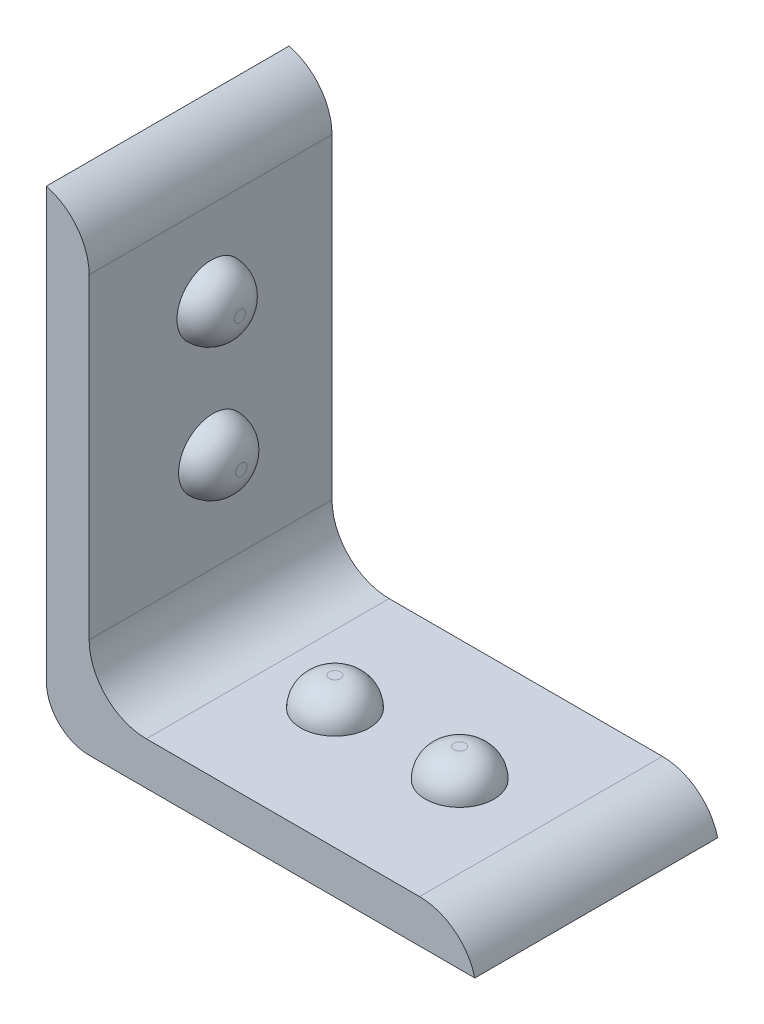
ISO-10303-21;
HEADER;
FILE_DESCRIPTION(('STEP AP214'),'2;1');
FILE_NAME('part.step','',(''),(''),'','','');
FILE_SCHEMA(('AUTOMOTIVE_DESIGN { 1 0 10303 214 1 1 1 1 }'));
ENDSEC;
DATA;
#1=APPLICATION_CONTEXT('core data for automotive mechanical design processes');
#2=APPLICATION_PROTOCOL_DEFINITION('international standard','automotive_design',2000,#1);
#3=PRODUCT_CONTEXT('',#1,'mechanical');
#4=PRODUCT('Part','Part','',(#3));
#5=PRODUCT_RELATED_PRODUCT_CATEGORY('part','',(#4));
#6=PRODUCT_DEFINITION_FORMATION('','',#4);
#7=PRODUCT_DEFINITION_CONTEXT('part definition',#1,'design');
#8=PRODUCT_DEFINITION('design','',#6,#7);
#9=PRODUCT_DEFINITION_SHAPE('','',#8);
#10=(LENGTH_UNIT() NAMED_UNIT(*) SI_UNIT(.MILLI.,.METRE.));
#11=(NAMED_UNIT(*) PLANE_ANGLE_UNIT() SI_UNIT($,.RADIAN.));
#12=(NAMED_UNIT(*) SI_UNIT($,.STERADIAN.) SOLID_ANGLE_UNIT());
#13=UNCERTAINTY_MEASURE_WITH_UNIT(LENGTH_MEASURE(1.E-05),#10,'distance_accuracy_value','');
#14=(GEOMETRIC_REPRESENTATION_CONTEXT(3) GLOBAL_UNCERTAINTY_ASSIGNED_CONTEXT((#13)) GLOBAL_UNIT_ASSIGNED_CONTEXT((#10,
#11,#12)) REPRESENTATION_CONTEXT('',''));
#15=CARTESIAN_POINT('',(0.,0.,0.));
#16=DIRECTION('',(0.,0.,1.));
#17=DIRECTION('',(1.,0.,0.));
#18=AXIS2_PLACEMENT_3D('',#15,#16,#17);
#19=CARTESIAN_POINT('',(0.,3.81,0.));
#20=DIRECTION('',(0.,-1.,0.));
#21=DIRECTION('',(0.,0.,-1.));
#22=AXIS2_PLACEMENT_3D('',#19,#20,#21);
#23=PLANE('',#22);
#24=CARTESIAN_POINT('',(-21.629116904149,3.81,11.4432822151741));
#25=DIRECTION('',(0.,-1.,0.));
#26=DIRECTION('',(0.,0.,-1.));
#27=AXIS2_PLACEMENT_3D('',#24,#25,#26);
#28=CIRCLE('',#27,3.048);
#29=CARTESIAN_POINT('',(-21.629116904149,3.81,8.3952822151741));
#30=VERTEX_POINT('',#29);
#31=EDGE_CURVE('E211',#30,#30,#28,.F.);
#32=ORIENTED_EDGE('',*,*,#31,.F.);
#33=EDGE_LOOP('',(#32));
#34=FACE_BOUND('',#33,.T.);
#35=CARTESIAN_POINT('',(-32.655326175498,3.81,11.503425174836));
#36=DIRECTION('',(0.,-1.,0.));
#37=DIRECTION('',(0.,0.,-1.));
#38=AXIS2_PLACEMENT_3D('',#35,#36,#37);
#39=CIRCLE('',#38,3.048);
#40=CARTESIAN_POINT('',(-32.655326175498,3.81,8.455425174836));
#41=VERTEX_POINT('',#40);
#42=EDGE_CURVE('E207',#41,#41,#39,.F.);
#43=ORIENTED_EDGE('',*,*,#42,.F.);
#44=EDGE_LOOP('',(#43));
#45=FACE_BOUND('',#44,.T.);
#46=DIRECTION('',(1.,0.,0.));
#47=VECTOR('',#46,1.);
#48=CARTESIAN_POINT('',(-47.5755096120473,3.81,22.2483060417843));
#49=LINE('',#48,#47);
#50=CARTESIAN_POINT('',(-38.6855096120473,3.81,22.2483060417843));
#51=VERTEX_POINT('',#50);
#52=CARTESIAN_POINT('',(-14.3941984617307,3.81,22.2483060417843));
#53=VERTEX_POINT('',#52);
#54=EDGE_CURVE('E145',#51,#53,#49,.T.);
#55=ORIENTED_EDGE('',*,*,#54,.T.);
#56=DIRECTION('',(0.,0.,-1.));
#57=VECTOR('',#56,1.);
#58=CARTESIAN_POINT('',(-14.3941984617307,3.81,0.));
#59=LINE('',#58,#57);
#60=CARTESIAN_POINT('',(-14.3941984617307,3.81,0.658306041784296));
#61=VERTEX_POINT('',#60);
#62=EDGE_CURVE('E168',#53,#61,#59,.T.);
#63=ORIENTED_EDGE('',*,*,#62,.T.);
#64=DIRECTION('',(1.,0.,0.));
#65=VECTOR('',#64,1.);
#66=CARTESIAN_POINT('',(-47.5755096120473,3.81,0.658306041784296));
#67=LINE('',#66,#65);
#68=CARTESIAN_POINT('',(-38.6855096120473,3.81,0.658306041784296));
#69=VERTEX_POINT('',#68);
#70=EDGE_CURVE('E130',#69,#61,#67,.T.);
#71=ORIENTED_EDGE('',*,*,#70,.F.);
#72=DIRECTION('',(0.,0.,-1.));
#73=VECTOR('',#72,1.);
#74=CARTESIAN_POINT('',(-38.6855096120473,3.81,22.2483060417843));
#75=LINE('',#74,#73);
#76=EDGE_CURVE('E165',#69,#51,#75,.F.);
#77=ORIENTED_EDGE('',*,*,#76,.T.);
#78=EDGE_LOOP('',(#55,#63,#71,#77));
#79=FACE_BOUND('',#78,.T.);
#80=ADVANCED_FACE('F43',(#34,#45,#79),#23,.F.);
#81=CARTESIAN_POINT('',(-47.5755096120473,3.81,22.2483060417843));
#82=DIRECTION('',(0.,0.,-1.));
#83=DIRECTION('',(-1.,0.,0.));
#84=AXIS2_PLACEMENT_3D('',#81,#82,#83);
#85=PLANE('',#84);
#86=DIRECTION('',(0.,-1.,0.));
#87=VECTOR('',#86,1.);
#88=CARTESIAN_POINT('',(-47.5755096120473,3.81,22.2483060417843));
#89=LINE('',#88,#87);
#90=CARTESIAN_POINT('',(-47.5755096120473,41.91,22.2483060417843));
#91=VERTEX_POINT('',#90);
#92=CARTESIAN_POINT('',(-47.5755096120473,3.81,22.2483060417843));
#93=VERTEX_POINT('',#92);
#94=EDGE_CURVE('E111',#91,#93,#89,.T.);
#95=ORIENTED_EDGE('',*,*,#94,.T.);
#96=CARTESIAN_POINT('',(-43.7655096120473,3.81,22.2483060417843));
#97=DIRECTION('',(0.,0.,-1.));
#98=DIRECTION('',(-1.,0.,0.));
#99=AXIS2_PLACEMENT_3D('',#96,#97,#98);
#100=CIRCLE('',#99,3.81);
#101=CARTESIAN_POINT('',(-43.7655096120473,0.,22.2483060417843));
#102=VERTEX_POINT('',#101);
#103=EDGE_CURVE('E67',#93,#102,#100,.F.);
#104=ORIENTED_EDGE('',*,*,#103,.T.);
#105=DIRECTION('',(1.,0.,0.));
#106=VECTOR('',#105,1.);
#107=CARTESIAN_POINT('',(-47.5755096120473,0.,22.2483060417843));
#108=LINE('',#107,#106);
#109=CARTESIAN_POINT('',(-9.47550961204729,0.,22.2483060417843));
#110=VERTEX_POINT('',#109);
#111=EDGE_CURVE('E144',#102,#110,#108,.T.);
#112=ORIENTED_EDGE('',*,*,#111,.T.);
#113=CARTESIAN_POINT('',(-14.3941984617307,-1.27,22.2483060417843));
#114=DIRECTION('',(0.,0.,-1.));
#115=DIRECTION('',(-1.,0.,0.));
#116=AXIS2_PLACEMENT_3D('',#113,#114,#115);
#117=CIRCLE('',#116,5.08);
#118=EDGE_CURVE('E118',#110,#53,#117,.F.);
#119=ORIENTED_EDGE('',*,*,#118,.T.);
#120=ORIENTED_EDGE('',*,*,#54,.F.);
#121=CARTESIAN_POINT('',(-38.6855096120473,8.89,22.2483060417843));
#122=DIRECTION('',(0.,0.,-1.));
#123=DIRECTION('',(-1.,0.,0.));
#124=AXIS2_PLACEMENT_3D('',#121,#122,#123);
#125=CIRCLE('',#124,5.08);
#126=CARTESIAN_POINT('',(-43.7655096120473,8.89000000000002,22.2483060417843));
#127=VERTEX_POINT('',#126);
#128=EDGE_CURVE('E187',#51,#127,#125,.T.);
#129=ORIENTED_EDGE('',*,*,#128,.T.);
#130=DIRECTION('',(0.,-1.,0.));
#131=VECTOR('',#130,1.);
#132=CARTESIAN_POINT('',(-43.7655096120473,41.91,22.2483060417843));
#133=LINE('',#132,#131);
#134=CARTESIAN_POINT('',(-43.7655096120473,36.9913111503166,22.2483060417843));
#135=VERTEX_POINT('',#134);
#136=EDGE_CURVE('E113',#135,#127,#133,.T.);
#137=ORIENTED_EDGE('',*,*,#136,.F.);
#138=CARTESIAN_POINT('',(-48.8455096120473,36.9913111503166,22.2483060417843));
#139=DIRECTION('',(0.,0.,-1.));
#140=DIRECTION('',(-1.,0.,0.));
#141=AXIS2_PLACEMENT_3D('',#138,#139,#140);
#142=CIRCLE('',#141,5.08);
#143=EDGE_CURVE('E108',#135,#91,#142,.F.);
#144=ORIENTED_EDGE('',*,*,#143,.T.);
#145=EDGE_LOOP('',(#95,#104,#112,#119,#120,#129,#137,#144));
#146=FACE_BOUND('',#145,.T.);
#147=ADVANCED_FACE('F110',(#146),#85,.F.);
#148=CARTESIAN_POINT('',(-47.5755096120473,3.81,0.658306041784296));
#149=DIRECTION('',(0.,0.,-1.));
#150=DIRECTION('',(-1.,0.,0.));
#151=AXIS2_PLACEMENT_3D('',#148,#149,#150);
#152=PLANE('',#151);
#153=DIRECTION('',(1.,0.,0.));
#154=VECTOR('',#153,1.);
#155=CARTESIAN_POINT('',(-47.5755096120473,0.,0.658306041784296));
#156=LINE('',#155,#154);
#157=CARTESIAN_POINT('',(-43.7655096120473,0.,0.658306041784296));
#158=VERTEX_POINT('',#157);
#159=CARTESIAN_POINT('',(-9.47550961204729,0.,0.658306041784296));
#160=VERTEX_POINT('',#159);
#161=EDGE_CURVE('E149',#158,#160,#156,.T.);
#162=ORIENTED_EDGE('',*,*,#161,.F.);
#163=CARTESIAN_POINT('',(-43.7655096120473,3.81,0.658306041784296));
#164=DIRECTION('',(0.,0.,-1.));
#165=DIRECTION('',(-1.,0.,0.));
#166=AXIS2_PLACEMENT_3D('',#163,#164,#165);
#167=CIRCLE('',#166,3.81);
#168=CARTESIAN_POINT('',(-47.5755096120473,3.81,0.658306041784296));
#169=VERTEX_POINT('',#168);
#170=EDGE_CURVE('E196',#158,#169,#167,.T.);
#171=ORIENTED_EDGE('',*,*,#170,.T.);
#172=DIRECTION('',(0.,-1.,0.));
#173=VECTOR('',#172,1.);
#174=CARTESIAN_POINT('',(-47.5755096120473,3.81,0.658306041784296));
#175=LINE('',#174,#173);
#176=CARTESIAN_POINT('',(-47.5755096120473,41.91,0.658306041784296));
#177=VERTEX_POINT('',#176);
#178=EDGE_CURVE('E119',#177,#169,#175,.T.);
#179=ORIENTED_EDGE('',*,*,#178,.F.);
#180=CARTESIAN_POINT('',(-48.8455096120473,36.9913111503166,0.658306041784296));
#181=DIRECTION('',(0.,0.,-1.));
#182=DIRECTION('',(-1.,0.,0.));
#183=AXIS2_PLACEMENT_3D('',#180,#181,#182);
#184=CIRCLE('',#183,5.08);
#185=CARTESIAN_POINT('',(-43.7655096120473,36.9913111503166,0.658306041784296));
#186=VERTEX_POINT('',#185);
#187=EDGE_CURVE('E133',#177,#186,#184,.T.);
#188=ORIENTED_EDGE('',*,*,#187,.T.);
#189=DIRECTION('',(0.,-1.,0.));
#190=VECTOR('',#189,1.);
#191=CARTESIAN_POINT('',(-43.7655096120473,41.91,0.658306041784296));
#192=LINE('',#191,#190);
#193=CARTESIAN_POINT('',(-43.7655096120473,8.89000000000002,0.658306041784296));
#194=VERTEX_POINT('',#193);
#195=EDGE_CURVE('E136',#186,#194,#192,.T.);
#196=ORIENTED_EDGE('',*,*,#195,.T.);
#197=CARTESIAN_POINT('',(-38.6855096120473,8.89,0.658306041784296));
#198=DIRECTION('',(0.,0.,-1.));
#199=DIRECTION('',(-1.,0.,0.));
#200=AXIS2_PLACEMENT_3D('',#197,#198,#199);
#201=CIRCLE('',#200,5.08);
#202=EDGE_CURVE('E184',#194,#69,#201,.F.);
#203=ORIENTED_EDGE('',*,*,#202,.T.);
#204=ORIENTED_EDGE('',*,*,#70,.T.);
#205=CARTESIAN_POINT('',(-14.3941984617307,-1.27,0.658306041784296));
#206=DIRECTION('',(0.,0.,-1.));
#207=DIRECTION('',(-1.,0.,0.));
#208=AXIS2_PLACEMENT_3D('',#205,#206,#207);
#209=CIRCLE('',#208,5.08);
#210=EDGE_CURVE('E173',#61,#160,#209,.T.);
#211=ORIENTED_EDGE('',*,*,#210,.T.);
#212=EDGE_LOOP('',(#162,#171,#179,#188,#196,#203,#204,#211));
#213=FACE_BOUND('',#212,.T.);
#214=ADVANCED_FACE('F246',(#213),#152,.T.);
#215=CARTESIAN_POINT('',(-47.5755096120473,3.81,0.658306041784296));
#216=DIRECTION('',(1.,0.,0.));
#217=DIRECTION('',(0.,0.,-1.));
#218=AXIS2_PLACEMENT_3D('',#215,#216,#217);
#219=PLANE('',#218);
#220=ORIENTED_EDGE('',*,*,#178,.T.);
#221=DIRECTION('',(0.,0.,1.));
#222=VECTOR('',#221,1.);
#223=CARTESIAN_POINT('',(-47.5755096120473,3.81,22.2483060417843));
#224=LINE('',#223,#222);
#225=EDGE_CURVE('E128',#169,#93,#224,.T.);
#226=ORIENTED_EDGE('',*,*,#225,.T.);
#227=ORIENTED_EDGE('',*,*,#94,.F.);
#228=DIRECTION('',(0.,0.,1.));
#229=VECTOR('',#228,1.);
#230=CARTESIAN_POINT('',(-47.5755096120473,41.91,0.658306041784296));
#231=LINE('',#230,#229);
#232=EDGE_CURVE('E126',#177,#91,#231,.T.);
#233=ORIENTED_EDGE('',*,*,#232,.F.);
#234=EDGE_LOOP('',(#220,#226,#227,#233));
#235=FACE_BOUND('',#234,.T.);
#236=ADVANCED_FACE('F125',(#235),#219,.F.);
#237=CARTESIAN_POINT('',(0.,0.,0.));
#238=DIRECTION('',(0.,-1.,0.));
#239=DIRECTION('',(0.,0.,-1.));
#240=AXIS2_PLACEMENT_3D('',#237,#238,#239);
#241=PLANE('',#240);
#242=ORIENTED_EDGE('',*,*,#111,.F.);
#243=DIRECTION('',(0.,0.,1.));
#244=VECTOR('',#243,1.);
#245=CARTESIAN_POINT('',(-43.7655096120473,0.,0.658306041784296));
#246=LINE('',#245,#244);
#247=EDGE_CURVE('E59',#102,#158,#246,.F.);
#248=ORIENTED_EDGE('',*,*,#247,.T.);
#249=ORIENTED_EDGE('',*,*,#161,.T.);
#250=DIRECTION('',(0.,0.,1.));
#251=VECTOR('',#250,1.);
#252=CARTESIAN_POINT('',(-9.47550961204729,0.,0.658306041784296));
#253=LINE('',#252,#251);
#254=EDGE_CURVE('E155',#160,#110,#253,.T.);
#255=ORIENTED_EDGE('',*,*,#254,.T.);
#256=EDGE_LOOP('',(#242,#248,#249,#255));
#257=FACE_BOUND('',#256,.T.);
#258=ADVANCED_FACE('F254',(#257),#241,.T.);
#259=CARTESIAN_POINT('',(-43.7655096120473,41.91,0.658306041784296));
#260=DIRECTION('',(-1.,0.,0.));
#261=DIRECTION('',(0.,0.,1.));
#262=AXIS2_PLACEMENT_3D('',#259,#260,#261);
#263=PLANE('',#262);
#264=CARTESIAN_POINT('',(-43.7655096120473,17.7589134633443,11.2525677485335));
#265=DIRECTION('',(-1.,0.,0.));
#266=DIRECTION('',(0.,0.,1.));
#267=AXIS2_PLACEMENT_3D('',#264,#265,#266);
#268=CIRCLE('',#267,3.048);
#269=CARTESIAN_POINT('',(-43.7655096120473,17.7589134633443,14.3005677485335));
#270=VERTEX_POINT('',#269);
#271=EDGE_CURVE('E203',#270,#270,#268,.F.);
#272=ORIENTED_EDGE('',*,*,#271,.F.);
#273=EDGE_LOOP('',(#272));
#274=FACE_BOUND('',#273,.T.);
#275=CARTESIAN_POINT('',(-43.7655096120473,29.6554055163701,11.3926737178806));
#276=DIRECTION('',(-1.,0.,0.));
#277=DIRECTION('',(0.,0.,1.));
#278=AXIS2_PLACEMENT_3D('',#275,#276,#277);
#279=CIRCLE('',#278,3.048);
#280=CARTESIAN_POINT('',(-43.7655096120473,29.6554055163701,14.4406737178806));
#281=VERTEX_POINT('',#280);
#282=EDGE_CURVE('E199',#281,#281,#279,.F.);
#283=ORIENTED_EDGE('',*,*,#282,.F.);
#284=EDGE_LOOP('',(#283));
#285=FACE_BOUND('',#284,.T.);
#286=ORIENTED_EDGE('',*,*,#195,.F.);
#287=DIRECTION('',(0.,0.,-1.));
#288=VECTOR('',#287,1.);
#289=CARTESIAN_POINT('',(-43.7655096120473,36.9913111503166,0.658306041784296));
#290=LINE('',#289,#288);
#291=EDGE_CURVE('E181',#186,#135,#290,.F.);
#292=ORIENTED_EDGE('',*,*,#291,.T.);
#293=ORIENTED_EDGE('',*,*,#136,.T.);
#294=DIRECTION('',(0.,0.,-1.));
#295=VECTOR('',#294,1.);
#296=CARTESIAN_POINT('',(-43.7655096120473,8.89,0.658306041784296));
#297=LINE('',#296,#295);
#298=EDGE_CURVE('E177',#127,#194,#297,.T.);
#299=ORIENTED_EDGE('',*,*,#298,.T.);
#300=EDGE_LOOP('',(#286,#292,#293,#299));
#301=FACE_BOUND('',#300,.T.);
#302=ADVANCED_FACE('F252',(#274,#285,#301),#263,.F.);
#303=CARTESIAN_POINT('',(-14.3941984617307,-1.27,0.658306041784296));
#304=DIRECTION('',(0.,0.,-1.));
#305=DIRECTION('',(-1.,0.,0.));
#306=AXIS2_PLACEMENT_3D('',#303,#304,#305);
#307=CYLINDRICAL_SURFACE('',#306,5.08);
#308=ORIENTED_EDGE('',*,*,#210,.F.);
#309=ORIENTED_EDGE('',*,*,#62,.F.);
#310=ORIENTED_EDGE('',*,*,#118,.F.);
#311=ORIENTED_EDGE('',*,*,#254,.F.);
#312=EDGE_LOOP('',(#308,#309,#310,#311));
#313=FACE_BOUND('',#312,.T.);
#314=ADVANCED_FACE('F262',(#313),#307,.T.);
#315=CARTESIAN_POINT('',(-48.8455096120473,36.9913111503166,0.));
#316=DIRECTION('',(0.,0.,-1.));
#317=DIRECTION('',(-1.,0.,0.));
#318=AXIS2_PLACEMENT_3D('',#315,#316,#317);
#319=CYLINDRICAL_SURFACE('',#318,5.08);
#320=ORIENTED_EDGE('',*,*,#143,.F.);
#321=ORIENTED_EDGE('',*,*,#291,.F.);
#322=ORIENTED_EDGE('',*,*,#187,.F.);
#323=ORIENTED_EDGE('',*,*,#232,.T.);
#324=EDGE_LOOP('',(#320,#321,#322,#323));
#325=FACE_BOUND('',#324,.T.);
#326=ADVANCED_FACE('F132',(#325),#319,.T.);
#327=CARTESIAN_POINT('',(-38.6855096120473,8.89,0.658306041784296));
#328=DIRECTION('',(0.,0.,1.));
#329=DIRECTION('',(1.,0.,0.));
#330=AXIS2_PLACEMENT_3D('',#327,#328,#329);
#331=CYLINDRICAL_SURFACE('',#330,5.08);
#332=ORIENTED_EDGE('',*,*,#128,.F.);
#333=ORIENTED_EDGE('',*,*,#76,.F.);
#334=ORIENTED_EDGE('',*,*,#202,.F.);
#335=ORIENTED_EDGE('',*,*,#298,.F.);
#336=EDGE_LOOP('',(#332,#333,#334,#335));
#337=FACE_BOUND('',#336,.T.);
#338=ADVANCED_FACE('F268',(#337),#331,.F.);
#339=CARTESIAN_POINT('',(-43.7655096120473,3.81,0.658306041784296));
#340=DIRECTION('',(0.,0.,-1.));
#341=DIRECTION('',(-1.,0.,0.));
#342=AXIS2_PLACEMENT_3D('',#339,#340,#341);
#343=CYLINDRICAL_SURFACE('',#342,3.81);
#344=ORIENTED_EDGE('',*,*,#170,.F.);
#345=ORIENTED_EDGE('',*,*,#247,.F.);
#346=ORIENTED_EDGE('',*,*,#103,.F.);
#347=ORIENTED_EDGE('',*,*,#225,.F.);
#348=EDGE_LOOP('',(#344,#345,#346,#347));
#349=FACE_BOUND('',#348,.T.);
#350=ADVANCED_FACE('F271',(#349),#343,.T.);
#351=CARTESIAN_POINT('',(-41.2255096120473,0.,0.));
#352=DIRECTION('',(1.,0.,0.));
#353=DIRECTION('',(0.,0.,-1.));
#354=AXIS2_PLACEMENT_3D('',#351,#352,#353);
#355=PLANE('',#354);
#356=CARTESIAN_POINT('',(-41.2255096120473,29.6554055163701,11.3926737178806));
#357=DIRECTION('',(1.,0.,0.));
#358=DIRECTION('',(0.,0.,-1.));
#359=AXIS2_PLACEMENT_3D('',#356,#357,#358);
#360=CIRCLE('',#359,0.508000000000001);
#361=CARTESIAN_POINT('',(-41.2255096120473,29.6554055163701,10.8846737178806));
#362=VERTEX_POINT('',#361);
#363=EDGE_CURVE('E11',#362,#362,#360,.T.);
#364=ORIENTED_EDGE('',*,*,#363,.T.);
#365=EDGE_LOOP('',(#364));
#366=FACE_BOUND('',#365,.T.);
#367=ADVANCED_FACE('F275',(#366),#355,.T.);
#368=CARTESIAN_POINT('',(-41.2255096120473,17.7589134633443,11.2525677485335));
#369=DIRECTION('',(1.,0.,0.));
#370=DIRECTION('',(0.,0.,-1.));
#371=AXIS2_PLACEMENT_3D('',#368,#369,#370);
#372=PLANE('',#371);
#373=CARTESIAN_POINT('',(-41.2255096120473,17.7589134633443,11.2525677485335));
#374=DIRECTION('',(1.,0.,0.));
#375=DIRECTION('',(0.,0.,-1.));
#376=AXIS2_PLACEMENT_3D('',#373,#374,#375);
#377=CIRCLE('',#376,0.508000000000001);
#378=CARTESIAN_POINT('',(-41.2255096120473,17.7589134633443,10.7445677485335));
#379=VERTEX_POINT('',#378);
#380=EDGE_CURVE('E52',#379,#379,#377,.T.);
#381=ORIENTED_EDGE('',*,*,#380,.T.);
#382=EDGE_LOOP('',(#381));
#383=FACE_BOUND('',#382,.T.);
#384=ADVANCED_FACE('F226',(#383),#372,.T.);
#385=CARTESIAN_POINT('',(0.,6.35,0.));
#386=DIRECTION('',(0.,1.,0.));
#387=DIRECTION('',(0.,0.,1.));
#388=AXIS2_PLACEMENT_3D('',#385,#386,#387);
#389=PLANE('',#388);
#390=CARTESIAN_POINT('',(-32.655326175498,6.35,11.503425174836));
#391=DIRECTION('',(0.,1.,0.));
#392=DIRECTION('',(0.,0.,1.));
#393=AXIS2_PLACEMENT_3D('',#390,#391,#392);
#394=CIRCLE('',#393,0.507999999999997);
#395=CARTESIAN_POINT('',(-32.655326175498,6.35,12.011425174836));
#396=VERTEX_POINT('',#395);
#397=EDGE_CURVE('E219',#396,#396,#394,.T.);
#398=ORIENTED_EDGE('',*,*,#397,.T.);
#399=EDGE_LOOP('',(#398));
#400=FACE_BOUND('',#399,.T.);
#401=ADVANCED_FACE('F283',(#400),#389,.T.);
#402=CARTESIAN_POINT('',(-21.629116904149,6.35,11.4432822151741));
#403=DIRECTION('',(0.,1.,0.));
#404=DIRECTION('',(0.,0.,1.));
#405=AXIS2_PLACEMENT_3D('',#402,#403,#404);
#406=PLANE('',#405);
#407=CARTESIAN_POINT('',(-21.629116904149,6.35,11.4432822151741));
#408=DIRECTION('',(0.,1.,0.));
#409=DIRECTION('',(0.,0.,1.));
#410=AXIS2_PLACEMENT_3D('',#407,#408,#409);
#411=CIRCLE('',#410,0.507999999999997);
#412=CARTESIAN_POINT('',(-21.629116904149,6.35,11.9512822151741));
#413=VERTEX_POINT('',#412);
#414=EDGE_CURVE('E215',#413,#413,#411,.T.);
#415=ORIENTED_EDGE('',*,*,#414,.T.);
#416=EDGE_LOOP('',(#415));
#417=FACE_BOUND('',#416,.T.);
#418=ADVANCED_FACE('F278',(#417),#406,.T.);
#419=CARTESIAN_POINT('',(-21.629116904149,3.81,11.4432822151741));
#420=DIRECTION('',(0.,1.,0.));
#421=DIRECTION('',(0.,0.,1.));
#422=AXIS2_PLACEMENT_3D('',#419,#420,#421);
#423=DEGENERATE_TOROIDAL_SURFACE('',#422,0.507999999999997,2.54,.T.);
#424=ORIENTED_EDGE('',*,*,#31,.T.);
#425=EDGE_LOOP('',(#424));
#426=FACE_BOUND('',#425,.T.);
#427=ORIENTED_EDGE('',*,*,#414,.F.);
#428=EDGE_LOOP('',(#427));
#429=FACE_BOUND('',#428,.T.);
#430=ADVANCED_FACE('F237',(#426,#429),#423,.T.);
#431=CARTESIAN_POINT('',(-32.655326175498,3.81,11.503425174836));
#432=DIRECTION('',(0.,1.,0.));
#433=DIRECTION('',(0.,0.,1.));
#434=AXIS2_PLACEMENT_3D('',#431,#432,#433);
#435=DEGENERATE_TOROIDAL_SURFACE('',#434,0.507999999999997,2.54,.T.);
#436=ORIENTED_EDGE('',*,*,#42,.T.);
#437=EDGE_LOOP('',(#436));
#438=FACE_BOUND('',#437,.T.);
#439=ORIENTED_EDGE('',*,*,#397,.F.);
#440=EDGE_LOOP('',(#439));
#441=FACE_BOUND('',#440,.T.);
#442=ADVANCED_FACE('F230',(#438,#441),#435,.T.);
#443=CARTESIAN_POINT('',(-43.7655096120473,17.7589134633443,11.2525677485335));
#444=DIRECTION('',(1.,0.,0.));
#445=DIRECTION('',(0.,0.,-1.));
#446=AXIS2_PLACEMENT_3D('',#443,#444,#445);
#447=DEGENERATE_TOROIDAL_SURFACE('',#446,0.508000000000001,2.54,.T.);
#448=ORIENTED_EDGE('',*,*,#271,.T.);
#449=EDGE_LOOP('',(#448));
#450=FACE_BOUND('',#449,.T.);
#451=ORIENTED_EDGE('',*,*,#380,.F.);
#452=EDGE_LOOP('',(#451));
#453=FACE_BOUND('',#452,.T.);
#454=ADVANCED_FACE('F228',(#450,#453),#447,.T.);
#455=CARTESIAN_POINT('',(-43.7655096120473,29.6554055163701,11.3926737178806));
#456=DIRECTION('',(1.,0.,0.));
#457=DIRECTION('',(0.,0.,-1.));
#458=AXIS2_PLACEMENT_3D('',#455,#456,#457);
#459=DEGENERATE_TOROIDAL_SURFACE('',#458,0.508000000000001,2.54,.T.);
#460=ORIENTED_EDGE('',*,*,#282,.T.);
#461=EDGE_LOOP('',(#460));
#462=FACE_BOUND('',#461,.T.);
#463=ORIENTED_EDGE('',*,*,#363,.F.);
#464=EDGE_LOOP('',(#463));
#465=FACE_BOUND('',#464,.T.);
#466=ADVANCED_FACE('F45',(#462,#465),#459,.T.);
#467=CLOSED_SHELL('',(#80,#147,#214,#236,#258,#302,#314,#326,#338,#350,#367,#384,#401,#418,#430,
#442,#454,#466));
#468=MANIFOLD_SOLID_BREP('B2',#467);
#469=ADVANCED_BREP_SHAPE_REPRESENTATION('',(#18,#468),#14);
#470=SHAPE_DEFINITION_REPRESENTATION(#9,#469);
ENDSEC;
END-ISO-10303-21;
